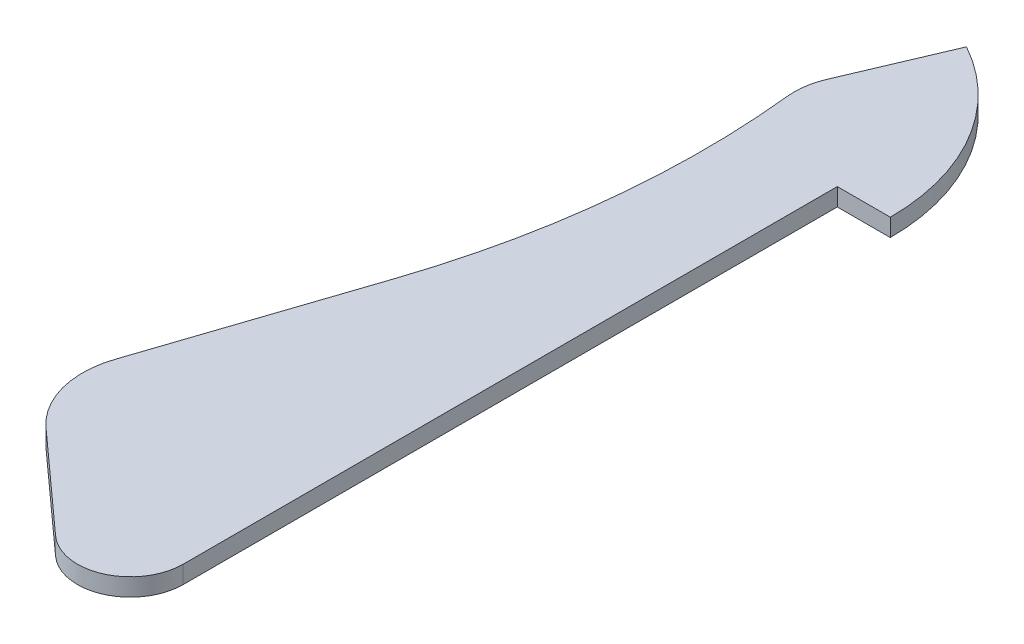
ISO-10303-21;
HEADER;
FILE_DESCRIPTION(('STEP AP214'),'2;1');
FILE_NAME('part.step','',(''),(''),'','','');
FILE_SCHEMA(('AUTOMOTIVE_DESIGN { 1 0 10303 214 1 1 1 1 }'));
ENDSEC;
DATA;
#1=APPLICATION_CONTEXT('core data for automotive mechanical design processes');
#2=APPLICATION_PROTOCOL_DEFINITION('international standard','automotive_design',2000,#1);
#3=PRODUCT_CONTEXT('',#1,'mechanical');
#4=PRODUCT('Part','Part','',(#3));
#5=PRODUCT_RELATED_PRODUCT_CATEGORY('part','',(#4));
#6=PRODUCT_DEFINITION_FORMATION('','',#4);
#7=PRODUCT_DEFINITION_CONTEXT('part definition',#1,'design');
#8=PRODUCT_DEFINITION('design','',#6,#7);
#9=PRODUCT_DEFINITION_SHAPE('','',#8);
#10=(LENGTH_UNIT() NAMED_UNIT(*) SI_UNIT(.MILLI.,.METRE.));
#11=(NAMED_UNIT(*) PLANE_ANGLE_UNIT() SI_UNIT($,.RADIAN.));
#12=(NAMED_UNIT(*) SI_UNIT($,.STERADIAN.) SOLID_ANGLE_UNIT());
#13=UNCERTAINTY_MEASURE_WITH_UNIT(LENGTH_MEASURE(1.E-05),#10,'distance_accuracy_value','');
#14=(GEOMETRIC_REPRESENTATION_CONTEXT(3) GLOBAL_UNCERTAINTY_ASSIGNED_CONTEXT((#13)) GLOBAL_UNIT_ASSIGNED_CONTEXT((#10,
#11,#12)) REPRESENTATION_CONTEXT('',''));
#15=CARTESIAN_POINT('',(0.,0.,0.));
#16=DIRECTION('',(0.,0.,1.));
#17=DIRECTION('',(1.,0.,0.));
#18=AXIS2_PLACEMENT_3D('',#15,#16,#17);
#19=CARTESIAN_POINT('',(0.,6.35,0.));
#20=DIRECTION('',(0.,0.,-1.));
#21=DIRECTION('',(-1.,0.,0.));
#22=AXIS2_PLACEMENT_3D('',#19,#20,#21);
#23=PLANE('',#22);
#24=DIRECTION('',(1.,0.,0.));
#25=VECTOR('',#24,1.);
#26=CARTESIAN_POINT('',(0.,0.,0.));
#27=LINE('',#26,#25);
#28=CARTESIAN_POINT('',(0.,0.,0.));
#29=VERTEX_POINT('',#28);
#30=CARTESIAN_POINT('',(19.05,0.,0.));
#31=VERTEX_POINT('',#30);
#32=EDGE_CURVE('E141',#29,#31,#27,.T.);
#33=ORIENTED_EDGE('',*,*,#32,.T.);
#34=DIRECTION('',(0.,-1.,0.));
#35=VECTOR('',#34,1.);
#36=CARTESIAN_POINT('',(19.05,6.35,0.));
#37=LINE('',#36,#35);
#38=CARTESIAN_POINT('',(19.05,6.35,0.));
#39=VERTEX_POINT('',#38);
#40=EDGE_CURVE('E11',#39,#31,#37,.T.);
#41=ORIENTED_EDGE('',*,*,#40,.F.);
#42=DIRECTION('',(1.,0.,0.));
#43=VECTOR('',#42,1.);
#44=CARTESIAN_POINT('',(0.,6.35,0.));
#45=LINE('',#44,#43);
#46=CARTESIAN_POINT('',(0.,6.35,0.));
#47=VERTEX_POINT('',#46);
#48=EDGE_CURVE('E159',#47,#39,#45,.T.);
#49=ORIENTED_EDGE('',*,*,#48,.F.);
#50=DIRECTION('',(0.,-1.,0.));
#51=VECTOR('',#50,1.);
#52=CARTESIAN_POINT('',(0.,6.35,0.));
#53=LINE('',#52,#51);
#54=EDGE_CURVE('E137',#47,#29,#53,.T.);
#55=ORIENTED_EDGE('',*,*,#54,.T.);
#56=EDGE_LOOP('',(#33,#41,#49,#55));
#57=FACE_BOUND('',#56,.T.);
#58=ADVANCED_FACE('F33',(#57),#23,.F.);
#59=CARTESIAN_POINT('',(-57.15,6.35,0.));
#60=DIRECTION('',(0.,-1.,0.));
#61=DIRECTION('',(0.,0.,-1.));
#62=AXIS2_PLACEMENT_3D('',#59,#60,#61);
#63=CYLINDRICAL_SURFACE('',#62,76.2);
#64=CARTESIAN_POINT('',(-57.15,0.,0.));
#65=DIRECTION('',(0.,1.,0.));
#66=DIRECTION('',(0.,0.,1.));
#67=AXIS2_PLACEMENT_3D('',#64,#65,#66);
#68=CIRCLE('',#67,76.2);
#69=CARTESIAN_POINT('',(-20.259833627042,0.,-66.6749999998161));
#70=VERTEX_POINT('',#69);
#71=EDGE_CURVE('E144',#31,#70,#68,.T.);
#72=ORIENTED_EDGE('',*,*,#71,.T.);
#73=DIRECTION('',(0.,-1.,0.));
#74=VECTOR('',#73,1.);
#75=CARTESIAN_POINT('',(-20.259833627042,6.35,-66.6749999998161));
#76=LINE('',#75,#74);
#77=CARTESIAN_POINT('',(-20.259833627042,6.35,-66.6749999998161));
#78=VERTEX_POINT('',#77);
#79=EDGE_CURVE('E41',#78,#70,#76,.T.);
#80=ORIENTED_EDGE('',*,*,#79,.F.);
#81=CARTESIAN_POINT('',(-57.15,6.35,0.));
#82=DIRECTION('',(0.,1.,0.));
#83=DIRECTION('',(0.,0.,1.));
#84=AXIS2_PLACEMENT_3D('',#81,#82,#83);
#85=CIRCLE('',#84,76.2);
#86=EDGE_CURVE('E98',#39,#78,#85,.T.);
#87=ORIENTED_EDGE('',*,*,#86,.F.);
#88=ORIENTED_EDGE('',*,*,#40,.T.);
#89=EDGE_LOOP('',(#72,#80,#87,#88));
#90=FACE_BOUND('',#89,.T.);
#91=ADVANCED_FACE('F208',(#90),#63,.T.);
#92=CARTESIAN_POINT('',(-20.259833627042,6.35,-66.6749999998161));
#93=DIRECTION('',(0.920287164315627,0.,0.391243575277475));
#94=DIRECTION('',(0.391243575277475,0.,-0.920287164315628));
#95=AXIS2_PLACEMENT_3D('',#92,#93,#94);
#96=PLANE('',#95);
#97=DIRECTION('',(-0.391243575277475,0.,0.920287164315627));
#98=VECTOR('',#97,1.);
#99=CARTESIAN_POINT('',(-20.259833627042,0.,-66.6749999998161));
#100=LINE('',#99,#98);
#101=CARTESIAN_POINT('',(-35.1662138451139,0.,-31.6120590393907));
#102=VERTEX_POINT('',#101);
#103=EDGE_CURVE('E146',#70,#102,#100,.T.);
#104=ORIENTED_EDGE('',*,*,#103,.T.);
#105=DIRECTION('',(0.,-1.,0.));
#106=VECTOR('',#105,1.);
#107=CARTESIAN_POINT('',(-35.1662138451139,6.35,-31.6120590393907));
#108=LINE('',#107,#106);
#109=CARTESIAN_POINT('',(-35.1662138451139,6.35,-31.6120590393907));
#110=VERTEX_POINT('',#109);
#111=EDGE_CURVE('E172',#110,#102,#108,.T.);
#112=ORIENTED_EDGE('',*,*,#111,.F.);
#113=DIRECTION('',(-0.391243575277475,0.,0.920287164315627));
#114=VECTOR('',#113,1.);
#115=CARTESIAN_POINT('',(-20.259833627042,6.35,-66.6749999998161));
#116=LINE('',#115,#114);
#117=EDGE_CURVE('E180',#78,#110,#116,.T.);
#118=ORIENTED_EDGE('',*,*,#117,.F.);
#119=ORIENTED_EDGE('',*,*,#79,.T.);
#120=EDGE_LOOP('',(#104,#112,#118,#119));
#121=FACE_BOUND('',#120,.T.);
#122=ADVANCED_FACE('F178',(#121),#96,.F.);
#123=CARTESIAN_POINT('',(-11.790919871497,6.35,-21.6744722273428));
#124=DIRECTION('',(0.,-1.,0.));
#125=DIRECTION('',(0.,0.,-1.));
#126=AXIS2_PLACEMENT_3D('',#123,#124,#125);
#127=CYLINDRICAL_SURFACE('',#126,25.4);
#128=CARTESIAN_POINT('',(-11.790919871497,0.,-21.6744722273428));
#129=DIRECTION('',(0.,1.,0.));
#130=DIRECTION('',(0.,0.,1.));
#131=AXIS2_PLACEMENT_3D('',#128,#129,#130);
#132=CIRCLE('',#131,25.4);
#133=CARTESIAN_POINT('',(-37.0485453596706,0.,-18.9888894788209));
#134=VERTEX_POINT('',#133);
#135=EDGE_CURVE('E148',#102,#134,#132,.T.);
#136=ORIENTED_EDGE('',*,*,#135,.T.);
#137=DIRECTION('',(0.,-1.,0.));
#138=VECTOR('',#137,1.);
#139=CARTESIAN_POINT('',(-37.0485453596706,6.35,-18.9888894788209));
#140=LINE('',#139,#138);
#141=CARTESIAN_POINT('',(-37.0485453596706,6.35,-18.9888894788209));
#142=VERTEX_POINT('',#141);
#143=EDGE_CURVE('E169',#142,#134,#140,.T.);
#144=ORIENTED_EDGE('',*,*,#143,.F.);
#145=CARTESIAN_POINT('',(-11.790919871497,6.35,-21.6744722273428));
#146=DIRECTION('',(0.,1.,0.));
#147=DIRECTION('',(0.,0.,1.));
#148=AXIS2_PLACEMENT_3D('',#145,#146,#147);
#149=CIRCLE('',#148,25.4);
#150=EDGE_CURVE('E198',#110,#142,#149,.T.);
#151=ORIENTED_EDGE('',*,*,#150,.F.);
#152=ORIENTED_EDGE('',*,*,#111,.T.);
#153=EDGE_LOOP('',(#136,#144,#151,#152));
#154=FACE_BOUND('',#153,.T.);
#155=ADVANCED_FACE('F189',(#154),#127,.T.);
#156=CARTESIAN_POINT('',(-336.194312345896,6.35,12.8185625513681));
#157=DIRECTION('',(0.,-1.,0.));
#158=DIRECTION('',(0.,0.,-1.));
#159=AXIS2_PLACEMENT_3D('',#156,#157,#158);
#160=CYLINDRICAL_SURFACE('',#159,300.832019423514);
#161=CARTESIAN_POINT('',(-336.194312345896,0.,12.8185625513681));
#162=DIRECTION('',(0.,-1.,0.));
#163=DIRECTION('',(0.,0.,1.));
#164=AXIS2_PLACEMENT_3D('',#161,#162,#163);
#165=CIRCLE('',#164,300.832019423514);
#166=CARTESIAN_POINT('',(-50.8,0.,107.95));
#167=VERTEX_POINT('',#166);
#168=EDGE_CURVE('E150',#134,#167,#165,.T.);
#169=ORIENTED_EDGE('',*,*,#168,.T.);
#170=DIRECTION('',(0.,-1.,0.));
#171=VECTOR('',#170,1.);
#172=CARTESIAN_POINT('',(-50.8,6.35,107.95));
#173=LINE('',#172,#171);
#174=CARTESIAN_POINT('',(-50.8,6.35,107.95));
#175=VERTEX_POINT('',#174);
#176=EDGE_CURVE('E166',#175,#167,#173,.T.);
#177=ORIENTED_EDGE('',*,*,#176,.F.);
#178=CARTESIAN_POINT('',(-336.194312345896,6.35,12.8185625513681));
#179=DIRECTION('',(0.,-1.,0.));
#180=DIRECTION('',(0.,0.,1.));
#181=AXIS2_PLACEMENT_3D('',#178,#179,#180);
#182=CIRCLE('',#181,300.832019423514);
#183=EDGE_CURVE('E195',#142,#175,#182,.T.);
#184=ORIENTED_EDGE('',*,*,#183,.F.);
#185=ORIENTED_EDGE('',*,*,#143,.T.);
#186=EDGE_LOOP('',(#169,#177,#184,#185));
#187=FACE_BOUND('',#186,.T.);
#188=ADVANCED_FACE('F193',(#187),#160,.F.);
#189=CARTESIAN_POINT('',(-75.9848700471077,6.35,183.504610141323));
#190=DIRECTION('',(0.948683298050514,0.,0.316227766016838));
#191=DIRECTION('',(0.316227766016838,0.,-0.948683298050514));
#192=AXIS2_PLACEMENT_3D('',#189,#190,#191);
#193=PLANE('',#192);
#194=DIRECTION('',(-0.316227766016838,0.,0.948683298050514));
#195=VECTOR('',#194,1.);
#196=CARTESIAN_POINT('',(-75.9848700471077,0.,183.504610141323));
#197=LINE('',#196,#195);
#198=CARTESIAN_POINT('',(-75.9848700471077,0.,183.504610141323));
#199=VERTEX_POINT('',#198);
#200=EDGE_CURVE('E152',#167,#199,#197,.T.);
#201=ORIENTED_EDGE('',*,*,#200,.T.);
#202=DIRECTION('',(0.,-1.,0.));
#203=VECTOR('',#202,1.);
#204=CARTESIAN_POINT('',(-75.9848700471077,6.35,183.504610141323));
#205=LINE('',#204,#203);
#206=CARTESIAN_POINT('',(-75.9848700471077,6.35,183.504610141323));
#207=VERTEX_POINT('',#206);
#208=EDGE_CURVE('E163',#207,#199,#205,.T.);
#209=ORIENTED_EDGE('',*,*,#208,.F.);
#210=DIRECTION('',(-0.316227766016838,0.,0.948683298050514));
#211=VECTOR('',#210,1.);
#212=CARTESIAN_POINT('',(-75.9848700471077,6.35,183.504610141323));
#213=LINE('',#212,#211);
#214=EDGE_CURVE('E197',#175,#207,#213,.T.);
#215=ORIENTED_EDGE('',*,*,#214,.F.);
#216=ORIENTED_EDGE('',*,*,#176,.T.);
#217=EDGE_LOOP('',(#201,#209,#215,#216));
#218=FACE_BOUND('',#217,.T.);
#219=ADVANCED_FACE('F220',(#218),#193,.F.);
#220=CARTESIAN_POINT('',(-45.8641753340039,6.35,193.544841712358));
#221=DIRECTION('',(0.,-1.,0.));
#222=DIRECTION('',(0.,0.,-1.));
#223=AXIS2_PLACEMENT_3D('',#220,#221,#222);
#224=CYLINDRICAL_SURFACE('',#223,31.75);
#225=CARTESIAN_POINT('',(-45.8641753340039,0.,193.544841712358));
#226=DIRECTION('',(0.,1.,0.));
#227=DIRECTION('',(0.,0.,-1.));
#228=AXIS2_PLACEMENT_3D('',#225,#226,#227);
#229=CIRCLE('',#228,31.75);
#230=CARTESIAN_POINT('',(-67.1399485298802,0.,217.111852021636));
#231=VERTEX_POINT('',#230);
#232=EDGE_CURVE('E154',#199,#231,#229,.T.);
#233=ORIENTED_EDGE('',*,*,#232,.T.);
#234=DIRECTION('',(0.,-1.,0.));
#235=VECTOR('',#234,1.);
#236=CARTESIAN_POINT('',(-67.1399485298802,6.35,217.111852021636));
#237=LINE('',#236,#235);
#238=CARTESIAN_POINT('',(-67.1399485298802,6.35,217.111852021636));
#239=VERTEX_POINT('',#238);
#240=EDGE_CURVE('E132',#239,#231,#237,.T.);
#241=ORIENTED_EDGE('',*,*,#240,.F.);
#242=CARTESIAN_POINT('',(-45.8641753340039,6.35,193.544841712358));
#243=DIRECTION('',(0.,1.,0.));
#244=DIRECTION('',(0.,0.,-1.));
#245=AXIS2_PLACEMENT_3D('',#242,#243,#244);
#246=CIRCLE('',#245,31.75);
#247=EDGE_CURVE('E123',#207,#239,#246,.T.);
#248=ORIENTED_EDGE('',*,*,#247,.F.);
#249=ORIENTED_EDGE('',*,*,#208,.T.);
#250=EDGE_LOOP('',(#233,#241,#248,#249));
#251=FACE_BOUND('',#250,.T.);
#252=ADVANCED_FACE('F223',(#251),#224,.T.);
#253=CARTESIAN_POINT('',(-31.75,6.35,249.061111111111));
#254=DIRECTION('',(0.670103092783505,0.,-0.742268041237114));
#255=DIRECTION('',(-0.742268041237114,0.,-0.670103092783505));
#256=AXIS2_PLACEMENT_3D('',#253,#254,#255);
#257=PLANE('',#256);
#258=DIRECTION('',(0.742268041237114,0.,0.670103092783505));
#259=VECTOR('',#258,1.);
#260=CARTESIAN_POINT('',(-31.75,0.,249.061111111111));
#261=LINE('',#260,#259);
#262=CARTESIAN_POINT('',(-31.75,0.,249.061111111111));
#263=VERTEX_POINT('',#262);
#264=EDGE_CURVE('E131',#231,#263,#261,.T.);
#265=ORIENTED_EDGE('',*,*,#264,.T.);
#266=DIRECTION('',(0.,-1.,0.));
#267=VECTOR('',#266,1.);
#268=CARTESIAN_POINT('',(-31.75,6.35,249.061111111111));
#269=LINE('',#268,#267);
#270=CARTESIAN_POINT('',(-31.75,6.35,249.061111111111));
#271=VERTEX_POINT('',#270);
#272=EDGE_CURVE('E128',#271,#263,#269,.T.);
#273=ORIENTED_EDGE('',*,*,#272,.F.);
#274=DIRECTION('',(0.742268041237114,0.,0.670103092783505));
#275=VECTOR('',#274,1.);
#276=CARTESIAN_POINT('',(-31.75,6.35,249.061111111111));
#277=LINE('',#276,#275);
#278=EDGE_CURVE('E117',#239,#271,#277,.T.);
#279=ORIENTED_EDGE('',*,*,#278,.F.);
#280=ORIENTED_EDGE('',*,*,#240,.T.);
#281=EDGE_LOOP('',(#265,#273,#279,#280));
#282=FACE_BOUND('',#281,.T.);
#283=ADVANCED_FACE('F129',(#282),#257,.F.);
#284=CARTESIAN_POINT('',(-19.0108024691358,6.35,234.95));
#285=DIRECTION('',(0.,-1.,0.));
#286=DIRECTION('',(0.,0.,-1.));
#287=AXIS2_PLACEMENT_3D('',#284,#285,#286);
#288=CYLINDRICAL_SURFACE('',#287,19.0108024691358);
#289=CARTESIAN_POINT('',(-19.0108024691358,0.,234.95));
#290=DIRECTION('',(0.,1.,0.));
#291=DIRECTION('',(0.,0.,-1.));
#292=AXIS2_PLACEMENT_3D('',#289,#290,#291);
#293=CIRCLE('',#292,19.0108024691358);
#294=CARTESIAN_POINT('',(0.,0.,234.95));
#295=VERTEX_POINT('',#294);
#296=EDGE_CURVE('E84',#263,#295,#293,.T.);
#297=ORIENTED_EDGE('',*,*,#296,.T.);
#298=DIRECTION('',(0.,-1.,0.));
#299=VECTOR('',#298,1.);
#300=CARTESIAN_POINT('',(0.,6.35,234.95));
#301=LINE('',#300,#299);
#302=CARTESIAN_POINT('',(0.,6.35,234.95));
#303=VERTEX_POINT('',#302);
#304=EDGE_CURVE('E133',#303,#295,#301,.T.);
#305=ORIENTED_EDGE('',*,*,#304,.F.);
#306=CARTESIAN_POINT('',(-19.0108024691358,6.35,234.95));
#307=DIRECTION('',(0.,1.,0.));
#308=DIRECTION('',(0.,0.,-1.));
#309=AXIS2_PLACEMENT_3D('',#306,#307,#308);
#310=CIRCLE('',#309,19.0108024691358);
#311=EDGE_CURVE('E121',#271,#303,#310,.T.);
#312=ORIENTED_EDGE('',*,*,#311,.F.);
#313=ORIENTED_EDGE('',*,*,#272,.T.);
#314=EDGE_LOOP('',(#297,#305,#312,#313));
#315=FACE_BOUND('',#314,.T.);
#316=ADVANCED_FACE('F135',(#315),#288,.T.);
#317=CARTESIAN_POINT('',(0.,6.35,0.));
#318=DIRECTION('',(-1.,0.,0.));
#319=DIRECTION('',(0.,0.,1.));
#320=AXIS2_PLACEMENT_3D('',#317,#318,#319);
#321=PLANE('',#320);
#322=DIRECTION('',(0.,0.,-1.));
#323=VECTOR('',#322,1.);
#324=CARTESIAN_POINT('',(0.,0.,0.));
#325=LINE('',#324,#323);
#326=EDGE_CURVE('E90',#295,#29,#325,.T.);
#327=ORIENTED_EDGE('',*,*,#326,.T.);
#328=ORIENTED_EDGE('',*,*,#54,.F.);
#329=DIRECTION('',(0.,0.,-1.));
#330=VECTOR('',#329,1.);
#331=CARTESIAN_POINT('',(0.,6.35,0.));
#332=LINE('',#331,#330);
#333=EDGE_CURVE('E49',#303,#47,#332,.T.);
#334=ORIENTED_EDGE('',*,*,#333,.F.);
#335=ORIENTED_EDGE('',*,*,#304,.T.);
#336=EDGE_LOOP('',(#327,#328,#334,#335));
#337=FACE_BOUND('',#336,.T.);
#338=ADVANCED_FACE('F232',(#337),#321,.F.);
#339=CARTESIAN_POINT('',(-57.15,6.35,0.));
#340=DIRECTION('',(0.,1.,0.));
#341=DIRECTION('',(0.,0.,1.));
#342=AXIS2_PLACEMENT_3D('',#339,#340,#341);
#343=PLANE('',#342);
#344=ORIENTED_EDGE('',*,*,#48,.T.);
#345=ORIENTED_EDGE('',*,*,#86,.T.);
#346=ORIENTED_EDGE('',*,*,#117,.T.);
#347=ORIENTED_EDGE('',*,*,#150,.T.);
#348=ORIENTED_EDGE('',*,*,#183,.T.);
#349=ORIENTED_EDGE('',*,*,#214,.T.);
#350=ORIENTED_EDGE('',*,*,#247,.T.);
#351=ORIENTED_EDGE('',*,*,#278,.T.);
#352=ORIENTED_EDGE('',*,*,#311,.T.);
#353=ORIENTED_EDGE('',*,*,#333,.T.);
#354=EDGE_LOOP('',(#344,#345,#346,#347,#348,#349,#350,#351,#352,#353));
#355=FACE_BOUND('',#354,.T.);
#356=ADVANCED_FACE('F119',(#355),#343,.T.);
#357=CARTESIAN_POINT('',(-57.15,0.,0.));
#358=DIRECTION('',(0.,1.,0.));
#359=DIRECTION('',(0.,0.,1.));
#360=AXIS2_PLACEMENT_3D('',#357,#358,#359);
#361=PLANE('',#360);
#362=ORIENTED_EDGE('',*,*,#32,.F.);
#363=ORIENTED_EDGE('',*,*,#326,.F.);
#364=ORIENTED_EDGE('',*,*,#296,.F.);
#365=ORIENTED_EDGE('',*,*,#264,.F.);
#366=ORIENTED_EDGE('',*,*,#232,.F.);
#367=ORIENTED_EDGE('',*,*,#200,.F.);
#368=ORIENTED_EDGE('',*,*,#168,.F.);
#369=ORIENTED_EDGE('',*,*,#135,.F.);
#370=ORIENTED_EDGE('',*,*,#103,.F.);
#371=ORIENTED_EDGE('',*,*,#71,.F.);
#372=EDGE_LOOP('',(#362,#363,#364,#365,#366,#367,#368,#369,#370,#371));
#373=FACE_BOUND('',#372,.T.);
#374=ADVANCED_FACE('F184',(#373),#361,.F.);
#375=CLOSED_SHELL('',(#58,#91,#122,#155,#188,#219,#252,#283,#316,#338,#356,#374));
#376=MANIFOLD_SOLID_BREP('B2',#375);
#377=ADVANCED_BREP_SHAPE_REPRESENTATION('',(#18,#376),#14);
#378=SHAPE_DEFINITION_REPRESENTATION(#9,#377);
ENDSEC;
END-ISO-10303-21;
